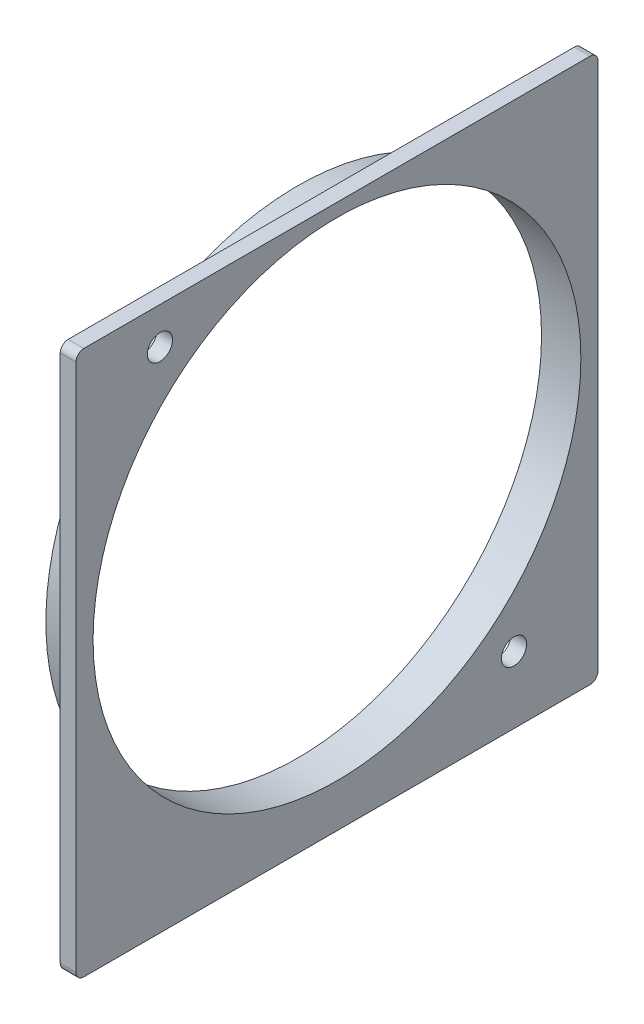
ISO-10303-21;
HEADER;
FILE_DESCRIPTION(('STEP AP214'),'2;1');
FILE_NAME('part.step','',(''),(''),'','','');
FILE_SCHEMA(('AUTOMOTIVE_DESIGN { 1 0 10303 214 1 1 1 1 }'));
ENDSEC;
DATA;
#1=APPLICATION_CONTEXT('core data for automotive mechanical design processes');
#2=APPLICATION_PROTOCOL_DEFINITION('international standard','automotive_design',2000,#1);
#3=PRODUCT_CONTEXT('',#1,'mechanical');
#4=PRODUCT('Part','Part','',(#3));
#5=PRODUCT_RELATED_PRODUCT_CATEGORY('part','',(#4));
#6=PRODUCT_DEFINITION_FORMATION('','',#4);
#7=PRODUCT_DEFINITION_CONTEXT('part definition',#1,'design');
#8=PRODUCT_DEFINITION('design','',#6,#7);
#9=PRODUCT_DEFINITION_SHAPE('','',#8);
#10=(LENGTH_UNIT() NAMED_UNIT(*) SI_UNIT(.MILLI.,.METRE.));
#11=(NAMED_UNIT(*) PLANE_ANGLE_UNIT() SI_UNIT($,.RADIAN.));
#12=(NAMED_UNIT(*) SI_UNIT($,.STERADIAN.) SOLID_ANGLE_UNIT());
#13=UNCERTAINTY_MEASURE_WITH_UNIT(LENGTH_MEASURE(1.E-05),#10,'distance_accuracy_value','');
#14=(GEOMETRIC_REPRESENTATION_CONTEXT(3) GLOBAL_UNCERTAINTY_ASSIGNED_CONTEXT((#13)) GLOBAL_UNIT_ASSIGNED_CONTEXT((#10,
#11,#12)) REPRESENTATION_CONTEXT('',''));
#15=CARTESIAN_POINT('',(0.,0.,0.));
#16=DIRECTION('',(0.,0.,1.));
#17=DIRECTION('',(1.,0.,0.));
#18=AXIS2_PLACEMENT_3D('',#15,#16,#17);
#19=CARTESIAN_POINT('',(2.,-34.59,-33.175));
#20=DIRECTION('',(0.,0.,1.));
#21=DIRECTION('',(1.,0.,0.));
#22=AXIS2_PLACEMENT_3D('',#19,#20,#21);
#23=PLANE('',#22);
#24=DIRECTION('',(0.,1.,0.));
#25=VECTOR('',#24,1.);
#26=CARTESIAN_POINT('',(2.,-34.59,-33.175));
#27=LINE('',#26,#25);
#28=CARTESIAN_POINT('',(2.,-33.59,-33.175));
#29=VERTEX_POINT('',#28);
#30=CARTESIAN_POINT('',(2.,33.59,-33.175));
#31=VERTEX_POINT('',#30);
#32=EDGE_CURVE('E129',#29,#31,#27,.T.);
#33=ORIENTED_EDGE('',*,*,#32,.F.);
#34=DIRECTION('',(-1.,0.,0.));
#35=VECTOR('',#34,1.);
#36=CARTESIAN_POINT('',(2.,-33.59,-33.175));
#37=LINE('',#36,#35);
#38=CARTESIAN_POINT('',(0.,-33.59,-33.175));
#39=VERTEX_POINT('',#38);
#40=EDGE_CURVE('E114',#29,#39,#37,.T.);
#41=ORIENTED_EDGE('',*,*,#40,.T.);
#42=DIRECTION('',(0.,1.,0.));
#43=VECTOR('',#42,1.);
#44=CARTESIAN_POINT('',(0.,-34.59,-33.175));
#45=LINE('',#44,#43);
#46=CARTESIAN_POINT('',(0.,33.59,-33.175));
#47=VERTEX_POINT('',#46);
#48=EDGE_CURVE('E126',#39,#47,#45,.T.);
#49=ORIENTED_EDGE('',*,*,#48,.T.);
#50=DIRECTION('',(-1.,0.,0.));
#51=VECTOR('',#50,1.);
#52=CARTESIAN_POINT('',(2.,33.59,-33.175));
#53=LINE('',#52,#51);
#54=EDGE_CURVE('E131',#47,#31,#53,.F.);
#55=ORIENTED_EDGE('',*,*,#54,.T.);
#56=EDGE_LOOP('',(#33,#41,#49,#55));
#57=FACE_BOUND('',#56,.T.);
#58=ADVANCED_FACE('F43',(#57),#23,.F.);
#59=CARTESIAN_POINT('',(2.,34.59,33.175));
#60=DIRECTION('',(0.,-1.,0.));
#61=DIRECTION('',(0.,0.,-1.));
#62=AXIS2_PLACEMENT_3D('',#59,#60,#61);
#63=PLANE('',#62);
#64=DIRECTION('',(0.,0.,1.));
#65=VECTOR('',#64,1.);
#66=CARTESIAN_POINT('',(2.,34.59,33.175));
#67=LINE('',#66,#65);
#68=CARTESIAN_POINT('',(2.,34.59,-32.175));
#69=VERTEX_POINT('',#68);
#70=CARTESIAN_POINT('',(2.,34.59,32.175));
#71=VERTEX_POINT('',#70);
#72=EDGE_CURVE('E176',#69,#71,#67,.T.);
#73=ORIENTED_EDGE('',*,*,#72,.F.);
#74=DIRECTION('',(-1.,0.,0.));
#75=VECTOR('',#74,1.);
#76=CARTESIAN_POINT('',(2.,34.59,-32.175));
#77=LINE('',#76,#75);
#78=CARTESIAN_POINT('',(0.,34.59,-32.175));
#79=VERTEX_POINT('',#78);
#80=EDGE_CURVE('E11',#69,#79,#77,.T.);
#81=ORIENTED_EDGE('',*,*,#80,.T.);
#82=DIRECTION('',(0.,0.,1.));
#83=VECTOR('',#82,1.);
#84=CARTESIAN_POINT('',(0.,34.59,33.175));
#85=LINE('',#84,#83);
#86=CARTESIAN_POINT('',(0.,34.59,32.175));
#87=VERTEX_POINT('',#86);
#88=EDGE_CURVE('E136',#79,#87,#85,.T.);
#89=ORIENTED_EDGE('',*,*,#88,.T.);
#90=DIRECTION('',(-1.,0.,0.));
#91=VECTOR('',#90,1.);
#92=CARTESIAN_POINT('',(2.,34.59,32.175));
#93=LINE('',#92,#91);
#94=EDGE_CURVE('E51',#87,#71,#93,.F.);
#95=ORIENTED_EDGE('',*,*,#94,.T.);
#96=EDGE_LOOP('',(#73,#81,#89,#95));
#97=FACE_BOUND('',#96,.T.);
#98=ADVANCED_FACE('F175',(#97),#63,.F.);
#99=CARTESIAN_POINT('',(2.,-34.59,33.175));
#100=DIRECTION('',(0.,0.,-1.));
#101=DIRECTION('',(-1.,0.,0.));
#102=AXIS2_PLACEMENT_3D('',#99,#100,#101);
#103=PLANE('',#102);
#104=DIRECTION('',(0.,-1.,0.));
#105=VECTOR('',#104,1.);
#106=CARTESIAN_POINT('',(0.,-34.59,33.175));
#107=LINE('',#106,#105);
#108=CARTESIAN_POINT('',(0.,33.59,33.175));
#109=VERTEX_POINT('',#108);
#110=CARTESIAN_POINT('',(0.,-33.59,33.175));
#111=VERTEX_POINT('',#110);
#112=EDGE_CURVE('E140',#109,#111,#107,.T.);
#113=ORIENTED_EDGE('',*,*,#112,.T.);
#114=DIRECTION('',(-1.,0.,0.));
#115=VECTOR('',#114,1.);
#116=CARTESIAN_POINT('',(2.,-33.59,33.175));
#117=LINE('',#116,#115);
#118=CARTESIAN_POINT('',(2.,-33.59,33.175));
#119=VERTEX_POINT('',#118);
#120=EDGE_CURVE('E58',#111,#119,#117,.F.);
#121=ORIENTED_EDGE('',*,*,#120,.T.);
#122=DIRECTION('',(0.,-1.,0.));
#123=VECTOR('',#122,1.);
#124=CARTESIAN_POINT('',(2.,-34.59,33.175));
#125=LINE('',#124,#123);
#126=CARTESIAN_POINT('',(2.,33.59,33.175));
#127=VERTEX_POINT('',#126);
#128=EDGE_CURVE('E182',#127,#119,#125,.T.);
#129=ORIENTED_EDGE('',*,*,#128,.F.);
#130=DIRECTION('',(-1.,0.,0.));
#131=VECTOR('',#130,1.);
#132=CARTESIAN_POINT('',(2.,33.59,33.175));
#133=LINE('',#132,#131);
#134=EDGE_CURVE('E169',#127,#109,#133,.T.);
#135=ORIENTED_EDGE('',*,*,#134,.T.);
#136=EDGE_LOOP('',(#113,#121,#129,#135));
#137=FACE_BOUND('',#136,.T.);
#138=ADVANCED_FACE('F186',(#137),#103,.F.);
#139=CARTESIAN_POINT('',(2.,-34.59,33.175));
#140=DIRECTION('',(0.,1.,0.));
#141=DIRECTION('',(0.,0.,1.));
#142=AXIS2_PLACEMENT_3D('',#139,#140,#141);
#143=PLANE('',#142);
#144=DIRECTION('',(0.,0.,-1.));
#145=VECTOR('',#144,1.);
#146=CARTESIAN_POINT('',(0.,-34.59,33.175));
#147=LINE('',#146,#145);
#148=CARTESIAN_POINT('',(0.,-34.59,32.175));
#149=VERTEX_POINT('',#148);
#150=CARTESIAN_POINT('',(0.,-34.59,-32.175));
#151=VERTEX_POINT('',#150);
#152=EDGE_CURVE('E150',#149,#151,#147,.T.);
#153=ORIENTED_EDGE('',*,*,#152,.T.);
#154=DIRECTION('',(-1.,0.,0.));
#155=VECTOR('',#154,1.);
#156=CARTESIAN_POINT('',(2.,-34.59,-32.175));
#157=LINE('',#156,#155);
#158=CARTESIAN_POINT('',(2.,-34.59,-32.175));
#159=VERTEX_POINT('',#158);
#160=EDGE_CURVE('E115',#151,#159,#157,.F.);
#161=ORIENTED_EDGE('',*,*,#160,.T.);
#162=DIRECTION('',(0.,0.,-1.));
#163=VECTOR('',#162,1.);
#164=CARTESIAN_POINT('',(2.,-34.59,33.175));
#165=LINE('',#164,#163);
#166=CARTESIAN_POINT('',(2.,-34.59,32.175));
#167=VERTEX_POINT('',#166);
#168=EDGE_CURVE('E146',#167,#159,#165,.T.);
#169=ORIENTED_EDGE('',*,*,#168,.F.);
#170=DIRECTION('',(-1.,0.,0.));
#171=VECTOR('',#170,1.);
#172=CARTESIAN_POINT('',(2.,-34.59,32.175));
#173=LINE('',#172,#171);
#174=EDGE_CURVE('E120',#167,#149,#173,.T.);
#175=ORIENTED_EDGE('',*,*,#174,.T.);
#176=EDGE_LOOP('',(#153,#161,#169,#175));
#177=FACE_BOUND('',#176,.T.);
#178=ADVANCED_FACE('F193',(#177),#143,.F.);
#179=CARTESIAN_POINT('',(2.,0.,0.));
#180=DIRECTION('',(-1.,0.,0.));
#181=DIRECTION('',(0.,0.,1.));
#182=AXIS2_PLACEMENT_3D('',#179,#180,#181);
#183=PLANE('',#182);
#184=CARTESIAN_POINT('',(2.,29.91,22.5));
#185=DIRECTION('',(1.,0.,0.));
#186=DIRECTION('',(0.,0.,-1.));
#187=AXIS2_PLACEMENT_3D('',#184,#185,#186);
#188=CIRCLE('',#187,1.59999999999999);
#189=CARTESIAN_POINT('',(2.,29.91,20.9));
#190=VERTEX_POINT('',#189);
#191=EDGE_CURVE('E204',#190,#190,#188,.T.);
#192=ORIENTED_EDGE('',*,*,#191,.F.);
#193=EDGE_LOOP('',(#192));
#194=FACE_BOUND('',#193,.T.);
#195=CARTESIAN_POINT('',(2.,-26.09,-22.5));
#196=DIRECTION('',(1.,0.,0.));
#197=DIRECTION('',(0.,0.,-1.));
#198=AXIS2_PLACEMENT_3D('',#195,#196,#197);
#199=CIRCLE('',#198,1.59999999999999);
#200=CARTESIAN_POINT('',(2.,-26.09,-24.1));
#201=VERTEX_POINT('',#200);
#202=EDGE_CURVE('E198',#201,#201,#199,.T.);
#203=ORIENTED_EDGE('',*,*,#202,.F.);
#204=EDGE_LOOP('',(#203));
#205=FACE_BOUND('',#204,.T.);
#206=CARTESIAN_POINT('',(2.,1.91,0.));
#207=DIRECTION('',(-1.,0.,0.));
#208=DIRECTION('',(0.,0.,1.));
#209=AXIS2_PLACEMENT_3D('',#206,#207,#208);
#210=CIRCLE('',#209,31.);
#211=CARTESIAN_POINT('',(2.,1.91,31.));
#212=VERTEX_POINT('',#211);
#213=EDGE_CURVE('E137',#212,#212,#210,.T.);
#214=ORIENTED_EDGE('',*,*,#213,.T.);
#215=EDGE_LOOP('',(#214));
#216=FACE_BOUND('',#215,.T.);
#217=ORIENTED_EDGE('',*,*,#168,.T.);
#218=CARTESIAN_POINT('',(2.,-33.59,-32.175));
#219=DIRECTION('',(-1.,0.,0.));
#220=DIRECTION('',(0.,0.,1.));
#221=AXIS2_PLACEMENT_3D('',#218,#219,#220);
#222=CIRCLE('',#221,1.);
#223=EDGE_CURVE('E167',#159,#29,#222,.F.);
#224=ORIENTED_EDGE('',*,*,#223,.T.);
#225=ORIENTED_EDGE('',*,*,#32,.T.);
#226=CARTESIAN_POINT('',(2.,33.59,-32.175));
#227=DIRECTION('',(-1.,0.,0.));
#228=DIRECTION('',(0.,0.,1.));
#229=AXIS2_PLACEMENT_3D('',#226,#227,#228);
#230=CIRCLE('',#229,1.);
#231=EDGE_CURVE('E163',#31,#69,#230,.F.);
#232=ORIENTED_EDGE('',*,*,#231,.T.);
#233=ORIENTED_EDGE('',*,*,#72,.T.);
#234=CARTESIAN_POINT('',(2.,33.59,32.175));
#235=DIRECTION('',(-1.,0.,0.));
#236=DIRECTION('',(0.,0.,1.));
#237=AXIS2_PLACEMENT_3D('',#234,#235,#236);
#238=CIRCLE('',#237,1.);
#239=EDGE_CURVE('E65',#71,#127,#238,.F.);
#240=ORIENTED_EDGE('',*,*,#239,.T.);
#241=ORIENTED_EDGE('',*,*,#128,.T.);
#242=CARTESIAN_POINT('',(2.,-33.59,32.175));
#243=DIRECTION('',(-1.,0.,0.));
#244=DIRECTION('',(0.,0.,1.));
#245=AXIS2_PLACEMENT_3D('',#242,#243,#244);
#246=CIRCLE('',#245,1.);
#247=EDGE_CURVE('E165',#119,#167,#246,.F.);
#248=ORIENTED_EDGE('',*,*,#247,.T.);
#249=EDGE_LOOP('',(#217,#224,#225,#232,#233,#240,#241,#248));
#250=FACE_BOUND('',#249,.T.);
#251=ADVANCED_FACE('F180',(#194,#205,#216,#250),#183,.F.);
#252=CARTESIAN_POINT('',(0.,0.,0.));
#253=DIRECTION('',(-1.,0.,0.));
#254=DIRECTION('',(0.,0.,1.));
#255=AXIS2_PLACEMENT_3D('',#252,#253,#254);
#256=PLANE('',#255);
#257=CARTESIAN_POINT('',(0.,1.91,0.));
#258=DIRECTION('',(-1.,0.,0.));
#259=DIRECTION('',(0.,0.,1.));
#260=AXIS2_PLACEMENT_3D('',#257,#258,#259);
#261=CIRCLE('',#260,32.);
#262=CARTESIAN_POINT('',(0.,1.91,32.));
#263=VERTEX_POINT('',#262);
#264=EDGE_CURVE('E152',#263,#263,#261,.T.);
#265=ORIENTED_EDGE('',*,*,#264,.F.);
#266=EDGE_LOOP('',(#265));
#267=FACE_BOUND('',#266,.T.);
#268=CARTESIAN_POINT('',(0.,29.91,22.5));
#269=DIRECTION('',(1.,0.,0.));
#270=DIRECTION('',(0.,0.,-1.));
#271=AXIS2_PLACEMENT_3D('',#268,#269,#270);
#272=CIRCLE('',#271,1.6);
#273=CARTESIAN_POINT('',(0.,29.91,20.9));
#274=VERTEX_POINT('',#273);
#275=EDGE_CURVE('E201',#274,#274,#272,.T.);
#276=ORIENTED_EDGE('',*,*,#275,.T.);
#277=EDGE_LOOP('',(#276));
#278=FACE_BOUND('',#277,.T.);
#279=CARTESIAN_POINT('',(0.,-26.09,-22.5));
#280=DIRECTION('',(1.,0.,0.));
#281=DIRECTION('',(0.,0.,-1.));
#282=AXIS2_PLACEMENT_3D('',#279,#280,#281);
#283=CIRCLE('',#282,1.6);
#284=CARTESIAN_POINT('',(0.,-26.09,-24.1));
#285=VERTEX_POINT('',#284);
#286=EDGE_CURVE('E143',#285,#285,#283,.T.);
#287=ORIENTED_EDGE('',*,*,#286,.T.);
#288=EDGE_LOOP('',(#287));
#289=FACE_BOUND('',#288,.T.);
#290=ORIENTED_EDGE('',*,*,#48,.F.);
#291=CARTESIAN_POINT('',(0.,-33.59,-32.175));
#292=DIRECTION('',(-1.,0.,0.));
#293=DIRECTION('',(0.,0.,1.));
#294=AXIS2_PLACEMENT_3D('',#291,#292,#293);
#295=CIRCLE('',#294,1.);
#296=EDGE_CURVE('E110',#39,#151,#295,.T.);
#297=ORIENTED_EDGE('',*,*,#296,.T.);
#298=ORIENTED_EDGE('',*,*,#152,.F.);
#299=CARTESIAN_POINT('',(0.,-33.59,32.175));
#300=DIRECTION('',(-1.,0.,0.));
#301=DIRECTION('',(0.,0.,1.));
#302=AXIS2_PLACEMENT_3D('',#299,#300,#301);
#303=CIRCLE('',#302,1.);
#304=EDGE_CURVE('E121',#149,#111,#303,.T.);
#305=ORIENTED_EDGE('',*,*,#304,.T.);
#306=ORIENTED_EDGE('',*,*,#112,.F.);
#307=CARTESIAN_POINT('',(0.,33.59,32.175));
#308=DIRECTION('',(-1.,0.,0.));
#309=DIRECTION('',(0.,0.,1.));
#310=AXIS2_PLACEMENT_3D('',#307,#308,#309);
#311=CIRCLE('',#310,1.);
#312=EDGE_CURVE('E130',#109,#87,#311,.T.);
#313=ORIENTED_EDGE('',*,*,#312,.T.);
#314=ORIENTED_EDGE('',*,*,#88,.F.);
#315=CARTESIAN_POINT('',(0.,33.59,-32.175));
#316=DIRECTION('',(-1.,0.,0.));
#317=DIRECTION('',(0.,0.,1.));
#318=AXIS2_PLACEMENT_3D('',#315,#316,#317);
#319=CIRCLE('',#318,1.);
#320=EDGE_CURVE('E135',#79,#47,#319,.T.);
#321=ORIENTED_EDGE('',*,*,#320,.T.);
#322=EDGE_LOOP('',(#290,#297,#298,#305,#306,#313,#314,#321));
#323=FACE_BOUND('',#322,.T.);
#324=ADVANCED_FACE('F133',(#267,#278,#289,#323),#256,.T.);
#325=CARTESIAN_POINT('',(2.,1.91,0.));
#326=DIRECTION('',(-1.,0.,0.));
#327=DIRECTION('',(0.,0.,1.));
#328=AXIS2_PLACEMENT_3D('',#325,#326,#327);
#329=CYLINDRICAL_SURFACE('',#328,31.);
#330=ORIENTED_EDGE('',*,*,#213,.F.);
#331=EDGE_LOOP('',(#330));
#332=FACE_BOUND('',#331,.T.);
#333=CARTESIAN_POINT('',(-3.,1.91,0.));
#334=DIRECTION('',(1.,0.,0.));
#335=DIRECTION('',(0.,0.,-1.));
#336=AXIS2_PLACEMENT_3D('',#333,#334,#335);
#337=CIRCLE('',#336,31.);
#338=CARTESIAN_POINT('',(-3.,1.91,-31.));
#339=VERTEX_POINT('',#338);
#340=EDGE_CURVE('E210',#339,#339,#337,.T.);
#341=ORIENTED_EDGE('',*,*,#340,.F.);
#342=EDGE_LOOP('',(#341));
#343=FACE_BOUND('',#342,.T.);
#344=ADVANCED_FACE('F217',(#332,#343),#329,.F.);
#345=CARTESIAN_POINT('',(2.,-26.09,-22.5));
#346=DIRECTION('',(1.,0.,0.));
#347=DIRECTION('',(0.,0.,-1.));
#348=AXIS2_PLACEMENT_3D('',#345,#346,#347);
#349=CYLINDRICAL_SURFACE('',#348,1.59999999999999);
#350=ORIENTED_EDGE('',*,*,#286,.F.);
#351=EDGE_LOOP('',(#350));
#352=FACE_BOUND('',#351,.T.);
#353=ORIENTED_EDGE('',*,*,#202,.T.);
#354=EDGE_LOOP('',(#353));
#355=FACE_BOUND('',#354,.T.);
#356=ADVANCED_FACE('F219',(#352,#355),#349,.F.);
#357=CARTESIAN_POINT('',(2.,29.91,22.5));
#358=DIRECTION('',(1.,0.,0.));
#359=DIRECTION('',(0.,0.,-1.));
#360=AXIS2_PLACEMENT_3D('',#357,#358,#359);
#361=CYLINDRICAL_SURFACE('',#360,1.59999999999999);
#362=ORIENTED_EDGE('',*,*,#275,.F.);
#363=EDGE_LOOP('',(#362));
#364=FACE_BOUND('',#363,.T.);
#365=ORIENTED_EDGE('',*,*,#191,.T.);
#366=EDGE_LOOP('',(#365));
#367=FACE_BOUND('',#366,.T.);
#368=ADVANCED_FACE('F227',(#364,#367),#361,.F.);
#369=CARTESIAN_POINT('',(-3.,1.91,0.));
#370=DIRECTION('',(1.,0.,0.));
#371=DIRECTION('',(0.,0.,-1.));
#372=AXIS2_PLACEMENT_3D('',#369,#370,#371);
#373=CYLINDRICAL_SURFACE('',#372,32.);
#374=CARTESIAN_POINT('',(-3.,1.91,0.));
#375=DIRECTION('',(1.,0.,0.));
#376=DIRECTION('',(0.,0.,-1.));
#377=AXIS2_PLACEMENT_3D('',#374,#375,#376);
#378=CIRCLE('',#377,32.);
#379=CARTESIAN_POINT('',(-3.,1.91,-32.));
#380=VERTEX_POINT('',#379);
#381=EDGE_CURVE('E207',#380,#380,#378,.T.);
#382=ORIENTED_EDGE('',*,*,#381,.T.);
#383=EDGE_LOOP('',(#382));
#384=FACE_BOUND('',#383,.T.);
#385=ORIENTED_EDGE('',*,*,#264,.T.);
#386=EDGE_LOOP('',(#385));
#387=FACE_BOUND('',#386,.T.);
#388=ADVANCED_FACE('F280',(#384,#387),#373,.T.);
#389=CARTESIAN_POINT('',(-3.,1.91,0.));
#390=DIRECTION('',(1.,0.,0.));
#391=DIRECTION('',(0.,0.,-1.));
#392=AXIS2_PLACEMENT_3D('',#389,#390,#391);
#393=PLANE('',#392);
#394=ORIENTED_EDGE('',*,*,#340,.T.);
#395=EDGE_LOOP('',(#394));
#396=FACE_BOUND('',#395,.T.);
#397=ORIENTED_EDGE('',*,*,#381,.F.);
#398=EDGE_LOOP('',(#397));
#399=FACE_BOUND('',#398,.T.);
#400=ADVANCED_FACE('F214',(#396,#399),#393,.F.);
#401=CARTESIAN_POINT('',(2.,-33.59,-32.175));
#402=DIRECTION('',(-1.,0.,0.));
#403=DIRECTION('',(0.,0.,1.));
#404=AXIS2_PLACEMENT_3D('',#401,#402,#403);
#405=CYLINDRICAL_SURFACE('',#404,1.);
#406=ORIENTED_EDGE('',*,*,#223,.F.);
#407=ORIENTED_EDGE('',*,*,#160,.F.);
#408=ORIENTED_EDGE('',*,*,#296,.F.);
#409=ORIENTED_EDGE('',*,*,#40,.F.);
#410=EDGE_LOOP('',(#406,#407,#408,#409));
#411=FACE_BOUND('',#410,.T.);
#412=ADVANCED_FACE('F113',(#411),#405,.T.);
#413=CARTESIAN_POINT('',(2.,-33.59,32.175));
#414=DIRECTION('',(-1.,0.,0.));
#415=DIRECTION('',(0.,0.,1.));
#416=AXIS2_PLACEMENT_3D('',#413,#414,#415);
#417=CYLINDRICAL_SURFACE('',#416,1.);
#418=ORIENTED_EDGE('',*,*,#247,.F.);
#419=ORIENTED_EDGE('',*,*,#120,.F.);
#420=ORIENTED_EDGE('',*,*,#304,.F.);
#421=ORIENTED_EDGE('',*,*,#174,.F.);
#422=EDGE_LOOP('',(#418,#419,#420,#421));
#423=FACE_BOUND('',#422,.T.);
#424=ADVANCED_FACE('F190',(#423),#417,.T.);
#425=CARTESIAN_POINT('',(2.,33.59,-32.175));
#426=DIRECTION('',(-1.,0.,0.));
#427=DIRECTION('',(0.,0.,1.));
#428=AXIS2_PLACEMENT_3D('',#425,#426,#427);
#429=CYLINDRICAL_SURFACE('',#428,1.);
#430=ORIENTED_EDGE('',*,*,#231,.F.);
#431=ORIENTED_EDGE('',*,*,#54,.F.);
#432=ORIENTED_EDGE('',*,*,#320,.F.);
#433=ORIENTED_EDGE('',*,*,#80,.F.);
#434=EDGE_LOOP('',(#430,#431,#432,#433));
#435=FACE_BOUND('',#434,.T.);
#436=ADVANCED_FACE('F247',(#435),#429,.T.);
#437=CARTESIAN_POINT('',(2.,33.59,32.175));
#438=DIRECTION('',(-1.,0.,0.));
#439=DIRECTION('',(0.,0.,1.));
#440=AXIS2_PLACEMENT_3D('',#437,#438,#439);
#441=CYLINDRICAL_SURFACE('',#440,1.);
#442=ORIENTED_EDGE('',*,*,#239,.F.);
#443=ORIENTED_EDGE('',*,*,#94,.F.);
#444=ORIENTED_EDGE('',*,*,#312,.F.);
#445=ORIENTED_EDGE('',*,*,#134,.F.);
#446=EDGE_LOOP('',(#442,#443,#444,#445));
#447=FACE_BOUND('',#446,.T.);
#448=ADVANCED_FACE('F45',(#447),#441,.T.);
#449=CLOSED_SHELL('',(#58,#98,#138,#178,#251,#324,#344,#356,#368,#388,#400,#412,#424,#436,#448));
#450=MANIFOLD_SOLID_BREP('B2',#449);
#451=ADVANCED_BREP_SHAPE_REPRESENTATION('',(#18,#450),#14);
#452=SHAPE_DEFINITION_REPRESENTATION(#9,#451);
ENDSEC;
END-ISO-10303-21;
